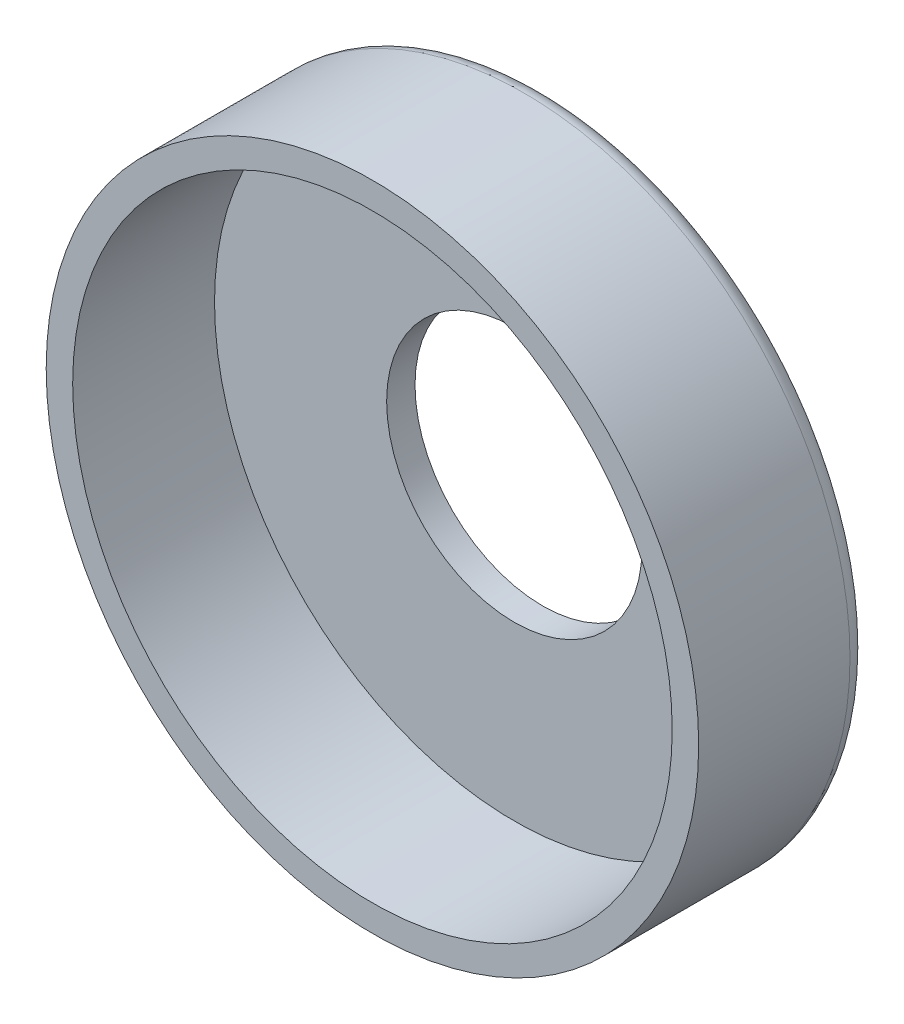
ISO-10303-21;
HEADER;
FILE_DESCRIPTION(('STEP AP214'),'2;1');
FILE_NAME('part.step','',(''),(''),'','','');
FILE_SCHEMA(('AUTOMOTIVE_DESIGN { 1 0 10303 214 1 1 1 1 }'));
ENDSEC;
DATA;
#1=APPLICATION_CONTEXT('core data for automotive mechanical design processes');
#2=APPLICATION_PROTOCOL_DEFINITION('international standard','automotive_design',2000,#1);
#3=PRODUCT_CONTEXT('',#1,'mechanical');
#4=PRODUCT('Part','Part','',(#3));
#5=PRODUCT_RELATED_PRODUCT_CATEGORY('part','',(#4));
#6=PRODUCT_DEFINITION_FORMATION('','',#4);
#7=PRODUCT_DEFINITION_CONTEXT('part definition',#1,'design');
#8=PRODUCT_DEFINITION('design','',#6,#7);
#9=PRODUCT_DEFINITION_SHAPE('','',#8);
#10=(LENGTH_UNIT() NAMED_UNIT(*) SI_UNIT(.MILLI.,.METRE.));
#11=(NAMED_UNIT(*) PLANE_ANGLE_UNIT() SI_UNIT($,.RADIAN.));
#12=(NAMED_UNIT(*) SI_UNIT($,.STERADIAN.) SOLID_ANGLE_UNIT());
#13=UNCERTAINTY_MEASURE_WITH_UNIT(LENGTH_MEASURE(1.E-05),#10,'distance_accuracy_value','');
#14=(GEOMETRIC_REPRESENTATION_CONTEXT(3) GLOBAL_UNCERTAINTY_ASSIGNED_CONTEXT((#13)) GLOBAL_UNIT_ASSIGNED_CONTEXT((#10,
#11,#12)) REPRESENTATION_CONTEXT('',''));
#15=CARTESIAN_POINT('',(0.,0.,0.));
#16=DIRECTION('',(0.,0.,1.));
#17=DIRECTION('',(1.,0.,0.));
#18=AXIS2_PLACEMENT_3D('',#15,#16,#17);
#19=CARTESIAN_POINT('',(0.,0.,3.));
#20=DIRECTION('',(0.,0.,-1.));
#21=DIRECTION('',(-1.,0.,0.));
#22=AXIS2_PLACEMENT_3D('',#19,#20,#21);
#23=CYLINDRICAL_SURFACE('',#22,34.5);
#24=CARTESIAN_POINT('',(0.,0.,2.));
#25=DIRECTION('',(0.,0.,1.));
#26=DIRECTION('',(1.,0.,0.));
#27=AXIS2_PLACEMENT_3D('',#24,#25,#26);
#28=CIRCLE('',#27,34.5);
#29=CARTESIAN_POINT('',(34.5,0.,2.));
#30=VERTEX_POINT('',#29);
#31=EDGE_CURVE('E38',#30,#30,#28,.T.);
#32=ORIENTED_EDGE('',*,*,#31,.T.);
#33=EDGE_LOOP('',(#32));
#34=FACE_BOUND('',#33,.T.);
#35=CARTESIAN_POINT('',(0.,0.,18.));
#36=DIRECTION('',(0.,0.,1.));
#37=DIRECTION('',(1.,0.,0.));
#38=AXIS2_PLACEMENT_3D('',#35,#36,#37);
#39=CIRCLE('',#38,34.5);
#40=CARTESIAN_POINT('',(34.5,0.,18.));
#41=VERTEX_POINT('',#40);
#42=EDGE_CURVE('E46',#41,#41,#39,.T.);
#43=ORIENTED_EDGE('',*,*,#42,.F.);
#44=EDGE_LOOP('',(#43));
#45=FACE_BOUND('',#44,.T.);
#46=ADVANCED_FACE('F31',(#34,#45),#23,.T.);
#47=CARTESIAN_POINT('',(0.,0.,0.));
#48=DIRECTION('',(0.,0.,1.));
#49=DIRECTION('',(1.,0.,0.));
#50=AXIS2_PLACEMENT_3D('',#47,#48,#49);
#51=PLANE('',#50);
#52=CARTESIAN_POINT('',(0.,0.,0.));
#53=DIRECTION('',(0.,0.,1.));
#54=DIRECTION('',(1.,0.,0.));
#55=AXIS2_PLACEMENT_3D('',#52,#53,#54);
#56=CIRCLE('',#55,32.5);
#57=CARTESIAN_POINT('',(32.5,0.,0.));
#58=VERTEX_POINT('',#57);
#59=EDGE_CURVE('E10',#58,#58,#56,.F.);
#60=ORIENTED_EDGE('',*,*,#59,.T.);
#61=EDGE_LOOP('',(#60));
#62=FACE_BOUND('',#61,.T.);
#63=CARTESIAN_POINT('',(0.,0.,0.));
#64=DIRECTION('',(0.,0.,1.));
#65=DIRECTION('',(1.,0.,0.));
#66=AXIS2_PLACEMENT_3D('',#63,#64,#65);
#67=CIRCLE('',#66,13.5);
#68=CARTESIAN_POINT('',(13.5,0.,0.));
#69=VERTEX_POINT('',#68);
#70=EDGE_CURVE('E51',#69,#69,#67,.T.);
#71=ORIENTED_EDGE('',*,*,#70,.T.);
#72=EDGE_LOOP('',(#71));
#73=FACE_BOUND('',#72,.T.);
#74=ADVANCED_FACE('F61',(#62,#73),#51,.F.);
#75=CARTESIAN_POINT('',(0.,0.,18.));
#76=DIRECTION('',(0.,0.,1.));
#77=DIRECTION('',(1.,0.,0.));
#78=AXIS2_PLACEMENT_3D('',#75,#76,#77);
#79=PLANE('',#78);
#80=ORIENTED_EDGE('',*,*,#42,.T.);
#81=EDGE_LOOP('',(#80));
#82=FACE_BOUND('',#81,.T.);
#83=CARTESIAN_POINT('',(0.,0.,18.));
#84=DIRECTION('',(0.,0.,1.));
#85=DIRECTION('',(1.,0.,0.));
#86=AXIS2_PLACEMENT_3D('',#83,#84,#85);
#87=CIRCLE('',#86,31.7);
#88=CARTESIAN_POINT('',(31.7,0.,18.));
#89=VERTEX_POINT('',#88);
#90=EDGE_CURVE('E55',#89,#89,#87,.T.);
#91=ORIENTED_EDGE('',*,*,#90,.F.);
#92=EDGE_LOOP('',(#91));
#93=FACE_BOUND('',#92,.T.);
#94=ADVANCED_FACE('F81',(#82,#93),#79,.T.);
#95=CARTESIAN_POINT('',(0.,0.,18.));
#96=DIRECTION('',(0.,0.,-1.));
#97=DIRECTION('',(-1.,0.,0.));
#98=AXIS2_PLACEMENT_3D('',#95,#96,#97);
#99=CYLINDRICAL_SURFACE('',#98,31.7);
#100=ORIENTED_EDGE('',*,*,#90,.T.);
#101=EDGE_LOOP('',(#100));
#102=FACE_BOUND('',#101,.T.);
#103=CARTESIAN_POINT('',(0.,0.,3.));
#104=DIRECTION('',(0.,0.,1.));
#105=DIRECTION('',(1.,0.,0.));
#106=AXIS2_PLACEMENT_3D('',#103,#104,#105);
#107=CIRCLE('',#106,31.7);
#108=CARTESIAN_POINT('',(31.7,0.,3.));
#109=VERTEX_POINT('',#108);
#110=EDGE_CURVE('E42',#109,#109,#107,.F.);
#111=ORIENTED_EDGE('',*,*,#110,.T.);
#112=EDGE_LOOP('',(#111));
#113=FACE_BOUND('',#112,.T.);
#114=ADVANCED_FACE('F73',(#102,#113),#99,.F.);
#115=CARTESIAN_POINT('',(0.,0.,3.));
#116=DIRECTION('',(0.,0.,1.));
#117=DIRECTION('',(1.,0.,0.));
#118=AXIS2_PLACEMENT_3D('',#115,#116,#117);
#119=PLANE('',#118);
#120=CARTESIAN_POINT('',(0.,0.,3.));
#121=DIRECTION('',(0.,0.,1.));
#122=DIRECTION('',(1.,0.,0.));
#123=AXIS2_PLACEMENT_3D('',#120,#121,#122);
#124=CIRCLE('',#123,13.5);
#125=CARTESIAN_POINT('',(13.5,0.,3.));
#126=VERTEX_POINT('',#125);
#127=EDGE_CURVE('E49',#126,#126,#124,.T.);
#128=ORIENTED_EDGE('',*,*,#127,.F.);
#129=EDGE_LOOP('',(#128));
#130=FACE_BOUND('',#129,.T.);
#131=ORIENTED_EDGE('',*,*,#110,.F.);
#132=EDGE_LOOP('',(#131));
#133=FACE_BOUND('',#132,.T.);
#134=ADVANCED_FACE('F65',(#130,#133),#119,.T.);
#135=CARTESIAN_POINT('',(0.,0.,18.));
#136=DIRECTION('',(0.,0.,-1.));
#137=DIRECTION('',(-1.,0.,0.));
#138=AXIS2_PLACEMENT_3D('',#135,#136,#137);
#139=CYLINDRICAL_SURFACE('',#138,13.5);
#140=ORIENTED_EDGE('',*,*,#127,.T.);
#141=EDGE_LOOP('',(#140));
#142=FACE_BOUND('',#141,.T.);
#143=ORIENTED_EDGE('',*,*,#70,.F.);
#144=EDGE_LOOP('',(#143));
#145=FACE_BOUND('',#144,.T.);
#146=ADVANCED_FACE('F63',(#142,#145),#139,.F.);
#147=CARTESIAN_POINT('',(0.,0.,2.));
#148=DIRECTION('',(0.,0.,1.));
#149=DIRECTION('',(1.,0.,0.));
#150=AXIS2_PLACEMENT_3D('',#147,#148,#149);
#151=TOROIDAL_SURFACE('',#150,32.5,2.);
#152=ORIENTED_EDGE('',*,*,#59,.F.);
#153=EDGE_LOOP('',(#152));
#154=FACE_BOUND('',#153,.T.);
#155=ORIENTED_EDGE('',*,*,#31,.F.);
#156=EDGE_LOOP('',(#155));
#157=FACE_BOUND('',#156,.T.);
#158=ADVANCED_FACE('F33',(#154,#157),#151,.T.);
#159=CLOSED_SHELL('',(#46,#74,#94,#114,#134,#146,#158));
#160=MANIFOLD_SOLID_BREP('B2',#159);
#161=ADVANCED_BREP_SHAPE_REPRESENTATION('',(#18,#160),#14);
#162=SHAPE_DEFINITION_REPRESENTATION(#9,#161);
ENDSEC;
END-ISO-10303-21;
